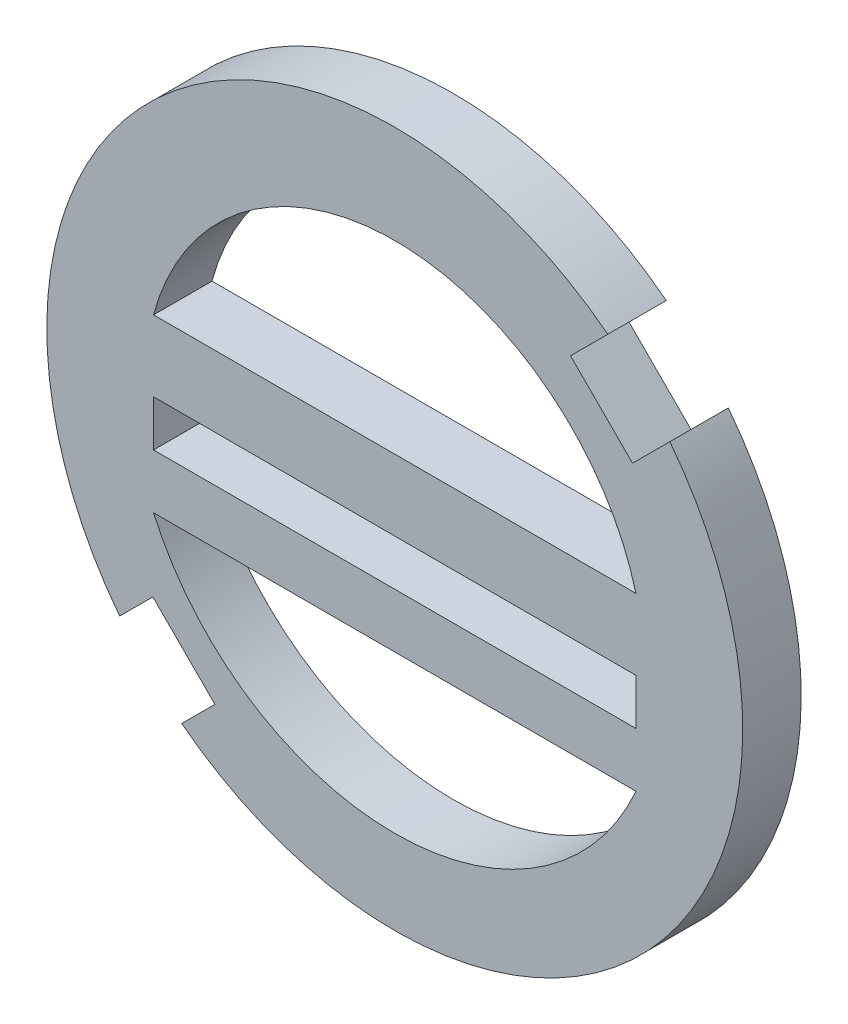
ISO-10303-21;
HEADER;
FILE_DESCRIPTION(('STEP AP214'),'2;1');
FILE_NAME('part.step','',(''),(''),'','','');
FILE_SCHEMA(('AUTOMOTIVE_DESIGN { 1 0 10303 214 1 1 1 1 }'));
ENDSEC;
DATA;
#1=APPLICATION_CONTEXT('core data for automotive mechanical design processes');
#2=APPLICATION_PROTOCOL_DEFINITION('international standard','automotive_design',2000,#1);
#3=PRODUCT_CONTEXT('',#1,'mechanical');
#4=PRODUCT('Part','Part','',(#3));
#5=PRODUCT_RELATED_PRODUCT_CATEGORY('part','',(#4));
#6=PRODUCT_DEFINITION_FORMATION('','',#4);
#7=PRODUCT_DEFINITION_CONTEXT('part definition',#1,'design');
#8=PRODUCT_DEFINITION('design','',#6,#7);
#9=PRODUCT_DEFINITION_SHAPE('','',#8);
#10=(LENGTH_UNIT() NAMED_UNIT(*) SI_UNIT(.MILLI.,.METRE.));
#11=(NAMED_UNIT(*) PLANE_ANGLE_UNIT() SI_UNIT($,.RADIAN.));
#12=(NAMED_UNIT(*) SI_UNIT($,.STERADIAN.) SOLID_ANGLE_UNIT());
#13=UNCERTAINTY_MEASURE_WITH_UNIT(LENGTH_MEASURE(1.E-05),#10,'distance_accuracy_value','');
#14=(GEOMETRIC_REPRESENTATION_CONTEXT(3) GLOBAL_UNCERTAINTY_ASSIGNED_CONTEXT((#13)) GLOBAL_UNIT_ASSIGNED_CONTEXT((#10,
#11,#12)) REPRESENTATION_CONTEXT('',''));
#15=CARTESIAN_POINT('',(0.,0.,0.));
#16=DIRECTION('',(0.,0.,1.));
#17=DIRECTION('',(1.,0.,0.));
#18=AXIS2_PLACEMENT_3D('',#15,#16,#17);
#19=CARTESIAN_POINT('',(0.,0.,12.7));
#20=DIRECTION('',(0.,0.,-1.));
#21=DIRECTION('',(-1.,0.,0.));
#22=AXIS2_PLACEMENT_3D('',#19,#20,#21);
#23=CYLINDRICAL_SURFACE('',#22,75.565);
#24=CARTESIAN_POINT('',(0.,0.,12.7));
#25=DIRECTION('',(0.,0.,1.));
#26=DIRECTION('',(1.,0.,0.));
#27=AXIS2_PLACEMENT_3D('',#24,#25,#26);
#28=CIRCLE('',#27,75.565);
#29=CARTESIAN_POINT('',(46.2711452661599,59.7415294477629,12.7));
#30=VERTEX_POINT('',#29);
#31=CARTESIAN_POINT('',(-59.7415294477625,-46.2711452661605,12.7));
#32=VERTEX_POINT('',#31);
#33=EDGE_CURVE('E266',#30,#32,#28,.T.);
#34=ORIENTED_EDGE('',*,*,#33,.F.);
#35=DIRECTION('',(0.,0.,-1.));
#36=VECTOR('',#35,1.);
#37=CARTESIAN_POINT('',(46.2711452661599,59.7415294477629,12.7));
#38=LINE('',#37,#36);
#39=CARTESIAN_POINT('',(46.2711452661599,59.7415294477629,0.));
#40=VERTEX_POINT('',#39);
#41=EDGE_CURVE('E11',#30,#40,#38,.T.);
#42=ORIENTED_EDGE('',*,*,#41,.T.);
#43=CARTESIAN_POINT('',(0.,0.,0.));
#44=DIRECTION('',(0.,0.,1.));
#45=DIRECTION('',(1.,0.,0.));
#46=AXIS2_PLACEMENT_3D('',#43,#44,#45);
#47=CIRCLE('',#46,75.565);
#48=CARTESIAN_POINT('',(-59.7415294477625,-46.2711452661605,0.));
#49=VERTEX_POINT('',#48);
#50=EDGE_CURVE('E170',#40,#49,#47,.T.);
#51=ORIENTED_EDGE('',*,*,#50,.T.);
#52=DIRECTION('',(0.,0.,-1.));
#53=VECTOR('',#52,1.);
#54=CARTESIAN_POINT('',(-59.7415294477625,-46.2711452661605,12.7));
#55=LINE('',#54,#53);
#56=EDGE_CURVE('E271',#49,#32,#55,.F.);
#57=ORIENTED_EDGE('',*,*,#56,.T.);
#58=EDGE_LOOP('',(#34,#42,#51,#57));
#59=FACE_BOUND('',#58,.T.);
#60=ADVANCED_FACE('F33',(#59),#23,.T.);
#61=CARTESIAN_POINT('',(0.,0.,12.7));
#62=DIRECTION('',(0.,0.,1.));
#63=DIRECTION('',(1.,0.,0.));
#64=AXIS2_PLACEMENT_3D('',#61,#62,#63);
#65=PLANE('',#64);
#66=DIRECTION('',(-0.707106781186545,-0.70710678118655,0.));
#67=VECTOR('',#66,1.);
#68=CARTESIAN_POINT('',(38.1660885145443,51.6364726961472,12.7));
#69=LINE('',#68,#67);
#70=CARTESIAN_POINT('',(38.1660885145443,51.6364726961472,12.7));
#71=VERTEX_POINT('',#70);
#72=EDGE_CURVE('E151',#30,#71,#69,.T.);
#73=ORIENTED_EDGE('',*,*,#72,.F.);
#74=ORIENTED_EDGE('',*,*,#33,.T.);
#75=DIRECTION('',(-0.707106781186527,-0.707106781186568,0.));
#76=VECTOR('',#75,1.);
#77=CARTESIAN_POINT('',(-61.5147544293228,-48.0443702477209,12.7));
#78=LINE('',#77,#76);
#79=CARTESIAN_POINT('',(-52.5344983082539,-39.0641141266515,12.7));
#80=VERTEX_POINT('',#79);
#81=EDGE_CURVE('E189',#80,#32,#78,.T.);
#82=ORIENTED_EDGE('',*,*,#81,.F.);
#83=DIRECTION('',(-0.70710678118655,0.707106781186545,0.));
#84=VECTOR('',#83,1.);
#85=CARTESIAN_POINT('',(-52.5344983082539,-39.0641141266515,12.7));
#86=LINE('',#85,#84);
#87=CARTESIAN_POINT('',(-39.0641141266503,-52.534498308255,12.7));
#88=VERTEX_POINT('',#87);
#89=EDGE_CURVE('E183',#88,#80,#86,.T.);
#90=ORIENTED_EDGE('',*,*,#89,.F.);
#91=DIRECTION('',(0.707106781186563,0.707106781186532,0.));
#92=VECTOR('',#91,1.);
#93=CARTESIAN_POINT('',(-39.0641141266503,-52.534498308255,12.7));
#94=LINE('',#93,#92);
#95=CARTESIAN_POINT('',(-46.2711452661591,-59.7415294477635,12.7));
#96=VERTEX_POINT('',#95);
#97=EDGE_CURVE('E191',#96,#88,#94,.T.);
#98=ORIENTED_EDGE('',*,*,#97,.F.);
#99=CARTESIAN_POINT('',(59.7415294477636,46.2711452661591,12.7));
#100=VERTEX_POINT('',#99);
#101=EDGE_CURVE('E263',#96,#100,#28,.T.);
#102=ORIENTED_EDGE('',*,*,#101,.T.);
#103=DIRECTION('',(0.707106781186546,0.707106781186549,0.));
#104=VECTOR('',#103,1.);
#105=CARTESIAN_POINT('',(60.6167288172172,47.1463446356127,12.7));
#106=LINE('',#105,#104);
#107=CARTESIAN_POINT('',(51.636472696148,38.1660885145435,12.7));
#108=VERTEX_POINT('',#107);
#109=EDGE_CURVE('E56',#108,#100,#106,.T.);
#110=ORIENTED_EDGE('',*,*,#109,.F.);
#111=DIRECTION('',(0.70710678118655,-0.707106781186545,0.));
#112=VECTOR('',#111,1.);
#113=CARTESIAN_POINT('',(51.636472696148,38.1660885145435,12.7));
#114=LINE('',#113,#112);
#115=EDGE_CURVE('E172',#71,#108,#114,.T.);
#116=ORIENTED_EDGE('',*,*,#115,.F.);
#117=EDGE_LOOP('',(#73,#74,#82,#90,#98,#102,#110,#116));
#118=FACE_BOUND('',#117,.T.);
#119=DIRECTION('',(1.,0.,0.));
#120=VECTOR('',#119,1.);
#121=CARTESIAN_POINT('',(-52.3875,-11.35,12.7));
#122=LINE('',#121,#120);
#123=CARTESIAN_POINT('',(-52.3875,-11.35,12.7));
#124=VERTEX_POINT('',#123);
#125=CARTESIAN_POINT('',(52.3875,-11.35,12.7));
#126=VERTEX_POINT('',#125);
#127=EDGE_CURVE('E234',#124,#126,#122,.T.);
#128=ORIENTED_EDGE('',*,*,#127,.F.);
#129=DIRECTION('',(0.,-1.,0.));
#130=VECTOR('',#129,1.);
#131=CARTESIAN_POINT('',(-52.3875,-1.34999999999999,12.7));
#132=LINE('',#131,#130);
#133=CARTESIAN_POINT('',(-52.3875,-1.34999999999999,12.7));
#134=VERTEX_POINT('',#133);
#135=EDGE_CURVE('E232',#134,#124,#132,.T.);
#136=ORIENTED_EDGE('',*,*,#135,.F.);
#137=DIRECTION('',(-1.,0.,0.));
#138=VECTOR('',#137,1.);
#139=CARTESIAN_POINT('',(-52.3875,-1.34999999999999,12.7));
#140=LINE('',#139,#138);
#141=CARTESIAN_POINT('',(52.3875,-1.35,12.7));
#142=VERTEX_POINT('',#141);
#143=EDGE_CURVE('E240',#142,#134,#140,.T.);
#144=ORIENTED_EDGE('',*,*,#143,.F.);
#145=DIRECTION('',(0.,1.,0.));
#146=VECTOR('',#145,1.);
#147=CARTESIAN_POINT('',(52.3875,-1.35,12.7));
#148=LINE('',#147,#146);
#149=EDGE_CURVE('E237',#126,#142,#148,.T.);
#150=ORIENTED_EDGE('',*,*,#149,.F.);
#151=EDGE_LOOP('',(#128,#136,#144,#150));
#152=FACE_BOUND('',#151,.T.);
#153=DIRECTION('',(1.,0.,0.));
#154=VECTOR('',#153,1.);
#155=CARTESIAN_POINT('',(-52.3875,14.055637655832,12.7));
#156=LINE('',#155,#154);
#157=CARTESIAN_POINT('',(-52.3875,14.055637655832,12.7));
#158=VERTEX_POINT('',#157);
#159=CARTESIAN_POINT('',(52.3875,14.055637655832,12.7));
#160=VERTEX_POINT('',#159);
#161=EDGE_CURVE('E218',#158,#160,#156,.T.);
#162=ORIENTED_EDGE('',*,*,#161,.F.);
#163=CARTESIAN_POINT('',(0.,0.,12.7));
#164=DIRECTION('',(0.,0.,1.));
#165=DIRECTION('',(-1.,0.,0.));
#166=AXIS2_PLACEMENT_3D('',#163,#164,#165);
#167=CIRCLE('',#166,54.2403088686084);
#168=EDGE_CURVE('E215',#160,#158,#167,.T.);
#169=ORIENTED_EDGE('',*,*,#168,.F.);
#170=EDGE_LOOP('',(#162,#169));
#171=FACE_BOUND('',#170,.T.);
#172=DIRECTION('',(-1.,0.,0.));
#173=VECTOR('',#172,1.);
#174=CARTESIAN_POINT('',(-52.3875,-23.1544562349696,12.7));
#175=LINE('',#174,#173);
#176=CARTESIAN_POINT('',(52.3875,-23.1544562349696,12.7));
#177=VERTEX_POINT('',#176);
#178=CARTESIAN_POINT('',(-52.3875,-23.1544562349696,12.7));
#179=VERTEX_POINT('',#178);
#180=EDGE_CURVE('E201',#177,#179,#175,.T.);
#181=ORIENTED_EDGE('',*,*,#180,.F.);
#182=CARTESIAN_POINT('',(0.,0.,12.7));
#183=DIRECTION('',(0.,0.,1.));
#184=DIRECTION('',(1.,0.,0.));
#185=AXIS2_PLACEMENT_3D('',#182,#183,#184);
#186=CIRCLE('',#185,57.2763389174546);
#187=EDGE_CURVE('E198',#179,#177,#186,.T.);
#188=ORIENTED_EDGE('',*,*,#187,.F.);
#189=EDGE_LOOP('',(#181,#188));
#190=FACE_BOUND('',#189,.T.);
#191=ADVANCED_FACE('F278',(#118,#152,#171,#190),#65,.T.);
#192=CARTESIAN_POINT('',(0.,0.,0.));
#193=DIRECTION('',(0.,0.,1.));
#194=DIRECTION('',(1.,0.,0.));
#195=AXIS2_PLACEMENT_3D('',#192,#193,#194);
#196=PLANE('',#195);
#197=ORIENTED_EDGE('',*,*,#50,.F.);
#198=DIRECTION('',(-0.707106781186545,-0.70710678118655,0.));
#199=VECTOR('',#198,1.);
#200=CARTESIAN_POINT('',(38.1660885145443,51.6364726961472,0.));
#201=LINE('',#200,#199);
#202=CARTESIAN_POINT('',(38.1660885145443,51.6364726961472,0.));
#203=VERTEX_POINT('',#202);
#204=EDGE_CURVE('E149',#40,#203,#201,.T.);
#205=ORIENTED_EDGE('',*,*,#204,.T.);
#206=DIRECTION('',(0.70710678118655,-0.707106781186545,0.));
#207=VECTOR('',#206,1.);
#208=CARTESIAN_POINT('',(51.636472696148,38.1660885145435,0.));
#209=LINE('',#208,#207);
#210=CARTESIAN_POINT('',(51.636472696148,38.1660885145435,0.));
#211=VERTEX_POINT('',#210);
#212=EDGE_CURVE('E159',#203,#211,#209,.T.);
#213=ORIENTED_EDGE('',*,*,#212,.T.);
#214=DIRECTION('',(0.707106781186546,0.707106781186549,0.));
#215=VECTOR('',#214,1.);
#216=CARTESIAN_POINT('',(60.6167288172172,47.1463446356127,0.));
#217=LINE('',#216,#215);
#218=CARTESIAN_POINT('',(59.7415294477636,46.2711452661591,0.));
#219=VERTEX_POINT('',#218);
#220=EDGE_CURVE('E156',#211,#219,#217,.T.);
#221=ORIENTED_EDGE('',*,*,#220,.T.);
#222=CARTESIAN_POINT('',(-46.2711452661591,-59.7415294477635,0.));
#223=VERTEX_POINT('',#222);
#224=EDGE_CURVE('E262',#223,#219,#47,.T.);
#225=ORIENTED_EDGE('',*,*,#224,.F.);
#226=DIRECTION('',(0.707106781186563,0.707106781186532,0.));
#227=VECTOR('',#226,1.);
#228=CARTESIAN_POINT('',(-39.0641141266503,-52.534498308255,0.));
#229=LINE('',#228,#227);
#230=CARTESIAN_POINT('',(-39.0641141266503,-52.534498308255,0.));
#231=VERTEX_POINT('',#230);
#232=EDGE_CURVE('E48',#223,#231,#229,.T.);
#233=ORIENTED_EDGE('',*,*,#232,.T.);
#234=DIRECTION('',(-0.70710678118655,0.707106781186545,0.));
#235=VECTOR('',#234,1.);
#236=CARTESIAN_POINT('',(-52.5344983082539,-39.0641141266515,0.));
#237=LINE('',#236,#235);
#238=CARTESIAN_POINT('',(-52.5344983082539,-39.0641141266515,0.));
#239=VERTEX_POINT('',#238);
#240=EDGE_CURVE('E185',#231,#239,#237,.T.);
#241=ORIENTED_EDGE('',*,*,#240,.T.);
#242=DIRECTION('',(-0.707106781186527,-0.707106781186568,0.));
#243=VECTOR('',#242,1.);
#244=CARTESIAN_POINT('',(-61.5147544293228,-48.0443702477209,0.));
#245=LINE('',#244,#243);
#246=EDGE_CURVE('E181',#239,#49,#245,.T.);
#247=ORIENTED_EDGE('',*,*,#246,.T.);
#248=EDGE_LOOP('',(#197,#205,#213,#221,#225,#233,#241,#247));
#249=FACE_BOUND('',#248,.T.);
#250=CARTESIAN_POINT('',(0.,0.,0.));
#251=DIRECTION('',(0.,0.,1.));
#252=DIRECTION('',(-1.,0.,0.));
#253=AXIS2_PLACEMENT_3D('',#250,#251,#252);
#254=CIRCLE('',#253,54.2403088686084);
#255=CARTESIAN_POINT('',(52.3875,14.055637655832,0.));
#256=VERTEX_POINT('',#255);
#257=CARTESIAN_POINT('',(-52.3875,14.055637655832,0.));
#258=VERTEX_POINT('',#257);
#259=EDGE_CURVE('E214',#256,#258,#254,.T.);
#260=ORIENTED_EDGE('',*,*,#259,.T.);
#261=DIRECTION('',(1.,0.,0.));
#262=VECTOR('',#261,1.);
#263=CARTESIAN_POINT('',(-52.3875,14.055637655832,0.));
#264=LINE('',#263,#262);
#265=EDGE_CURVE('E219',#258,#256,#264,.T.);
#266=ORIENTED_EDGE('',*,*,#265,.T.);
#267=EDGE_LOOP('',(#260,#266));
#268=FACE_BOUND('',#267,.T.);
#269=DIRECTION('',(0.,-1.,0.));
#270=VECTOR('',#269,1.);
#271=CARTESIAN_POINT('',(-52.3875,-1.34999999999999,0.));
#272=LINE('',#271,#270);
#273=CARTESIAN_POINT('',(-52.3875,-1.34999999999999,0.));
#274=VERTEX_POINT('',#273);
#275=CARTESIAN_POINT('',(-52.3875,-11.35,0.));
#276=VERTEX_POINT('',#275);
#277=EDGE_CURVE('E231',#274,#276,#272,.T.);
#278=ORIENTED_EDGE('',*,*,#277,.T.);
#279=DIRECTION('',(1.,0.,0.));
#280=VECTOR('',#279,1.);
#281=CARTESIAN_POINT('',(-52.3875,-11.35,0.));
#282=LINE('',#281,#280);
#283=CARTESIAN_POINT('',(52.3875,-11.35,0.));
#284=VERTEX_POINT('',#283);
#285=EDGE_CURVE('E245',#276,#284,#282,.T.);
#286=ORIENTED_EDGE('',*,*,#285,.T.);
#287=DIRECTION('',(0.,1.,0.));
#288=VECTOR('',#287,1.);
#289=CARTESIAN_POINT('',(52.3875,-1.35,0.));
#290=LINE('',#289,#288);
#291=CARTESIAN_POINT('',(52.3875,-1.35,0.));
#292=VERTEX_POINT('',#291);
#293=EDGE_CURVE('E248',#284,#292,#290,.T.);
#294=ORIENTED_EDGE('',*,*,#293,.T.);
#295=DIRECTION('',(-1.,0.,0.));
#296=VECTOR('',#295,1.);
#297=CARTESIAN_POINT('',(-52.3875,-1.34999999999999,0.));
#298=LINE('',#297,#296);
#299=EDGE_CURVE('E235',#292,#274,#298,.T.);
#300=ORIENTED_EDGE('',*,*,#299,.T.);
#301=EDGE_LOOP('',(#278,#286,#294,#300));
#302=FACE_BOUND('',#301,.T.);
#303=CARTESIAN_POINT('',(0.,0.,0.));
#304=DIRECTION('',(0.,0.,1.));
#305=DIRECTION('',(1.,0.,0.));
#306=AXIS2_PLACEMENT_3D('',#303,#304,#305);
#307=CIRCLE('',#306,57.2763389174546);
#308=CARTESIAN_POINT('',(-52.3875,-23.1544562349696,0.));
#309=VERTEX_POINT('',#308);
#310=CARTESIAN_POINT('',(52.3875,-23.1544562349696,0.));
#311=VERTEX_POINT('',#310);
#312=EDGE_CURVE('E179',#309,#311,#307,.T.);
#313=ORIENTED_EDGE('',*,*,#312,.T.);
#314=DIRECTION('',(-1.,0.,0.));
#315=VECTOR('',#314,1.);
#316=CARTESIAN_POINT('',(-52.3875,-23.1544562349696,0.));
#317=LINE('',#316,#315);
#318=EDGE_CURVE('E202',#311,#309,#317,.T.);
#319=ORIENTED_EDGE('',*,*,#318,.T.);
#320=EDGE_LOOP('',(#313,#319));
#321=FACE_BOUND('',#320,.T.);
#322=ADVANCED_FACE('F166',(#249,#268,#302,#321),#196,.F.);
#323=ORIENTED_EDGE('',*,*,#224,.T.);
#324=DIRECTION('',(0.,0.,-1.));
#325=VECTOR('',#324,1.);
#326=CARTESIAN_POINT('',(59.7415294477636,46.2711452661591,12.7));
#327=LINE('',#326,#325);
#328=EDGE_CURVE('E41',#219,#100,#327,.F.);
#329=ORIENTED_EDGE('',*,*,#328,.T.);
#330=ORIENTED_EDGE('',*,*,#101,.F.);
#331=DIRECTION('',(0.,0.,-1.));
#332=VECTOR('',#331,1.);
#333=CARTESIAN_POINT('',(-46.2711452661591,-59.7415294477635,12.7));
#334=LINE('',#333,#332);
#335=EDGE_CURVE('E269',#96,#223,#334,.T.);
#336=ORIENTED_EDGE('',*,*,#335,.T.);
#337=EDGE_LOOP('',(#323,#329,#330,#336));
#338=FACE_BOUND('',#337,.T.);
#339=ADVANCED_FACE('F35',(#338),#23,.T.);
#340=CARTESIAN_POINT('',(-52.3875,-1.34999999999999,12.7));
#341=DIRECTION('',(1.,0.,0.));
#342=DIRECTION('',(0.,0.,-1.));
#343=AXIS2_PLACEMENT_3D('',#340,#341,#342);
#344=PLANE('',#343);
#345=ORIENTED_EDGE('',*,*,#277,.F.);
#346=DIRECTION('',(0.,0.,-1.));
#347=VECTOR('',#346,1.);
#348=CARTESIAN_POINT('',(-52.3875,-1.34999999999999,12.7));
#349=LINE('',#348,#347);
#350=EDGE_CURVE('E242',#134,#274,#349,.T.);
#351=ORIENTED_EDGE('',*,*,#350,.F.);
#352=ORIENTED_EDGE('',*,*,#135,.T.);
#353=DIRECTION('',(0.,0.,-1.));
#354=VECTOR('',#353,1.);
#355=CARTESIAN_POINT('',(-52.3875,-11.35,12.7));
#356=LINE('',#355,#354);
#357=EDGE_CURVE('E259',#124,#276,#356,.T.);
#358=ORIENTED_EDGE('',*,*,#357,.T.);
#359=EDGE_LOOP('',(#345,#351,#352,#358));
#360=FACE_BOUND('',#359,.T.);
#361=ADVANCED_FACE('F310',(#360),#344,.T.);
#362=CARTESIAN_POINT('',(-52.3875,-11.35,12.7));
#363=DIRECTION('',(0.,1.,0.));
#364=DIRECTION('',(-1.,0.,0.));
#365=AXIS2_PLACEMENT_3D('',#362,#363,#364);
#366=PLANE('',#365);
#367=ORIENTED_EDGE('',*,*,#285,.F.);
#368=ORIENTED_EDGE('',*,*,#357,.F.);
#369=ORIENTED_EDGE('',*,*,#127,.T.);
#370=DIRECTION('',(0.,0.,-1.));
#371=VECTOR('',#370,1.);
#372=CARTESIAN_POINT('',(52.3875,-11.35,12.7));
#373=LINE('',#372,#371);
#374=EDGE_CURVE('E257',#126,#284,#373,.T.);
#375=ORIENTED_EDGE('',*,*,#374,.T.);
#376=EDGE_LOOP('',(#367,#368,#369,#375));
#377=FACE_BOUND('',#376,.T.);
#378=ADVANCED_FACE('F315',(#377),#366,.T.);
#379=CARTESIAN_POINT('',(52.3875,-1.35,12.7));
#380=DIRECTION('',(-1.,0.,0.));
#381=DIRECTION('',(0.,0.,1.));
#382=AXIS2_PLACEMENT_3D('',#379,#380,#381);
#383=PLANE('',#382);
#384=ORIENTED_EDGE('',*,*,#293,.F.);
#385=ORIENTED_EDGE('',*,*,#374,.F.);
#386=ORIENTED_EDGE('',*,*,#149,.T.);
#387=DIRECTION('',(0.,0.,-1.));
#388=VECTOR('',#387,1.);
#389=CARTESIAN_POINT('',(52.3875,-1.35,12.7));
#390=LINE('',#389,#388);
#391=EDGE_CURVE('E255',#142,#292,#390,.T.);
#392=ORIENTED_EDGE('',*,*,#391,.T.);
#393=EDGE_LOOP('',(#384,#385,#386,#392));
#394=FACE_BOUND('',#393,.T.);
#395=ADVANCED_FACE('F323',(#394),#383,.T.);
#396=CARTESIAN_POINT('',(-52.3875,-1.34999999999999,12.7));
#397=DIRECTION('',(0.,-1.,0.));
#398=DIRECTION('',(1.,0.,0.));
#399=AXIS2_PLACEMENT_3D('',#396,#397,#398);
#400=PLANE('',#399);
#401=ORIENTED_EDGE('',*,*,#299,.F.);
#402=ORIENTED_EDGE('',*,*,#391,.F.);
#403=ORIENTED_EDGE('',*,*,#143,.T.);
#404=ORIENTED_EDGE('',*,*,#350,.T.);
#405=EDGE_LOOP('',(#401,#402,#403,#404));
#406=FACE_BOUND('',#405,.T.);
#407=ADVANCED_FACE('F327',(#406),#400,.T.);
#408=CARTESIAN_POINT('',(0.,0.,12.7));
#409=DIRECTION('',(0.,0.,-1.));
#410=DIRECTION('',(-1.,0.,0.));
#411=AXIS2_PLACEMENT_3D('',#408,#409,#410);
#412=CYLINDRICAL_SURFACE('',#411,54.2403088686084);
#413=ORIENTED_EDGE('',*,*,#259,.F.);
#414=DIRECTION('',(0.,0.,-1.));
#415=VECTOR('',#414,1.);
#416=CARTESIAN_POINT('',(52.3875,14.055637655832,12.7));
#417=LINE('',#416,#415);
#418=EDGE_CURVE('E221',#160,#256,#417,.T.);
#419=ORIENTED_EDGE('',*,*,#418,.F.);
#420=ORIENTED_EDGE('',*,*,#168,.T.);
#421=DIRECTION('',(0.,0.,-1.));
#422=VECTOR('',#421,1.);
#423=CARTESIAN_POINT('',(-52.3875,14.055637655832,12.7));
#424=LINE('',#423,#422);
#425=EDGE_CURVE('E228',#158,#258,#424,.T.);
#426=ORIENTED_EDGE('',*,*,#425,.T.);
#427=EDGE_LOOP('',(#413,#419,#420,#426));
#428=FACE_BOUND('',#427,.T.);
#429=ADVANCED_FACE('F331',(#428),#412,.F.);
#430=CARTESIAN_POINT('',(-52.3875,14.055637655832,12.7));
#431=DIRECTION('',(0.,1.,0.));
#432=DIRECTION('',(0.,0.,1.));
#433=AXIS2_PLACEMENT_3D('',#430,#431,#432);
#434=PLANE('',#433);
#435=ORIENTED_EDGE('',*,*,#265,.F.);
#436=ORIENTED_EDGE('',*,*,#425,.F.);
#437=ORIENTED_EDGE('',*,*,#161,.T.);
#438=ORIENTED_EDGE('',*,*,#418,.T.);
#439=EDGE_LOOP('',(#435,#436,#437,#438));
#440=FACE_BOUND('',#439,.T.);
#441=ADVANCED_FACE('F335',(#440),#434,.T.);
#442=CARTESIAN_POINT('',(0.,0.,12.7));
#443=DIRECTION('',(0.,0.,-1.));
#444=DIRECTION('',(-1.,0.,0.));
#445=AXIS2_PLACEMENT_3D('',#442,#443,#444);
#446=CYLINDRICAL_SURFACE('',#445,57.2763389174546);
#447=ORIENTED_EDGE('',*,*,#312,.F.);
#448=DIRECTION('',(0.,0.,-1.));
#449=VECTOR('',#448,1.);
#450=CARTESIAN_POINT('',(-52.3875,-23.1544562349696,12.7));
#451=LINE('',#450,#449);
#452=EDGE_CURVE('E204',#179,#309,#451,.T.);
#453=ORIENTED_EDGE('',*,*,#452,.F.);
#454=ORIENTED_EDGE('',*,*,#187,.T.);
#455=DIRECTION('',(0.,0.,-1.));
#456=VECTOR('',#455,1.);
#457=CARTESIAN_POINT('',(52.3875,-23.1544562349696,12.7));
#458=LINE('',#457,#456);
#459=EDGE_CURVE('E211',#177,#311,#458,.T.);
#460=ORIENTED_EDGE('',*,*,#459,.T.);
#461=EDGE_LOOP('',(#447,#453,#454,#460));
#462=FACE_BOUND('',#461,.T.);
#463=ADVANCED_FACE('F301',(#462),#446,.F.);
#464=CARTESIAN_POINT('',(-52.3875,-23.1544562349696,12.7));
#465=DIRECTION('',(0.,-1.,0.));
#466=DIRECTION('',(0.,0.,-1.));
#467=AXIS2_PLACEMENT_3D('',#464,#465,#466);
#468=PLANE('',#467);
#469=ORIENTED_EDGE('',*,*,#318,.F.);
#470=ORIENTED_EDGE('',*,*,#459,.F.);
#471=ORIENTED_EDGE('',*,*,#180,.T.);
#472=ORIENTED_EDGE('',*,*,#452,.T.);
#473=EDGE_LOOP('',(#469,#470,#471,#472));
#474=FACE_BOUND('',#473,.T.);
#475=ADVANCED_FACE('F294',(#474),#468,.T.);
#476=CARTESIAN_POINT('',(-61.5147544293228,-48.0443702477209,0.));
#477=DIRECTION('',(-0.707106781186568,0.707106781186527,0.));
#478=DIRECTION('',(-0.707106781186527,-0.707106781186568,0.));
#479=AXIS2_PLACEMENT_3D('',#476,#477,#478);
#480=PLANE('',#479);
#481=ORIENTED_EDGE('',*,*,#246,.F.);
#482=DIRECTION('',(0.,0.,1.));
#483=VECTOR('',#482,1.);
#484=CARTESIAN_POINT('',(-52.5344983082539,-39.0641141266515,0.));
#485=LINE('',#484,#483);
#486=EDGE_CURVE('E177',#239,#80,#485,.T.);
#487=ORIENTED_EDGE('',*,*,#486,.T.);
#488=ORIENTED_EDGE('',*,*,#81,.T.);
#489=ORIENTED_EDGE('',*,*,#56,.F.);
#490=EDGE_LOOP('',(#481,#487,#488,#489));
#491=FACE_BOUND('',#490,.T.);
#492=ADVANCED_FACE('F292',(#491),#480,.F.);
#493=CARTESIAN_POINT('',(-39.0641141266503,-52.534498308255,0.));
#494=DIRECTION('',(0.707106781186532,-0.707106781186563,0.));
#495=DIRECTION('',(0.707106781186563,0.707106781186532,0.));
#496=AXIS2_PLACEMENT_3D('',#493,#494,#495);
#497=PLANE('',#496);
#498=ORIENTED_EDGE('',*,*,#97,.T.);
#499=DIRECTION('',(0.,0.,1.));
#500=VECTOR('',#499,1.);
#501=CARTESIAN_POINT('',(-39.0641141266503,-52.534498308255,0.));
#502=LINE('',#501,#500);
#503=EDGE_CURVE('E188',#231,#88,#502,.T.);
#504=ORIENTED_EDGE('',*,*,#503,.F.);
#505=ORIENTED_EDGE('',*,*,#232,.F.);
#506=ORIENTED_EDGE('',*,*,#335,.F.);
#507=EDGE_LOOP('',(#498,#504,#505,#506));
#508=FACE_BOUND('',#507,.T.);
#509=ADVANCED_FACE('F282',(#508),#497,.F.);
#510=CARTESIAN_POINT('',(-52.5344983082539,-39.0641141266515,0.));
#511=DIRECTION('',(0.707106781186545,0.70710678118655,0.));
#512=DIRECTION('',(-0.70710678118655,0.707106781186545,0.));
#513=AXIS2_PLACEMENT_3D('',#510,#511,#512);
#514=PLANE('',#513);
#515=ORIENTED_EDGE('',*,*,#89,.T.);
#516=ORIENTED_EDGE('',*,*,#486,.F.);
#517=ORIENTED_EDGE('',*,*,#240,.F.);
#518=ORIENTED_EDGE('',*,*,#503,.T.);
#519=EDGE_LOOP('',(#515,#516,#517,#518));
#520=FACE_BOUND('',#519,.T.);
#521=ADVANCED_FACE('F285',(#520),#514,.F.);
#522=CARTESIAN_POINT('',(38.1660885145443,51.6364726961472,0.));
#523=DIRECTION('',(-0.70710678118655,0.707106781186545,0.));
#524=DIRECTION('',(-0.707106781186545,-0.70710678118655,0.));
#525=AXIS2_PLACEMENT_3D('',#522,#523,#524);
#526=PLANE('',#525);
#527=ORIENTED_EDGE('',*,*,#72,.T.);
#528=DIRECTION('',(0.,0.,1.));
#529=VECTOR('',#528,1.);
#530=CARTESIAN_POINT('',(38.1660885145443,51.6364726961472,0.));
#531=LINE('',#530,#529);
#532=EDGE_CURVE('E145',#203,#71,#531,.T.);
#533=ORIENTED_EDGE('',*,*,#532,.F.);
#534=ORIENTED_EDGE('',*,*,#204,.F.);
#535=ORIENTED_EDGE('',*,*,#41,.F.);
#536=EDGE_LOOP('',(#527,#533,#534,#535));
#537=FACE_BOUND('',#536,.T.);
#538=ADVANCED_FACE('F147',(#537),#526,.F.);
#539=CARTESIAN_POINT('',(60.6167288172172,47.1463446356127,0.));
#540=DIRECTION('',(0.707106781186549,-0.707106781186545,0.));
#541=DIRECTION('',(0.707106781186546,0.70710678118655,0.));
#542=AXIS2_PLACEMENT_3D('',#539,#540,#541);
#543=PLANE('',#542);
#544=ORIENTED_EDGE('',*,*,#220,.F.);
#545=DIRECTION('',(0.,0.,1.));
#546=VECTOR('',#545,1.);
#547=CARTESIAN_POINT('',(51.636472696148,38.1660885145435,0.));
#548=LINE('',#547,#546);
#549=EDGE_CURVE('E155',#211,#108,#548,.T.);
#550=ORIENTED_EDGE('',*,*,#549,.T.);
#551=ORIENTED_EDGE('',*,*,#109,.T.);
#552=ORIENTED_EDGE('',*,*,#328,.F.);
#553=EDGE_LOOP('',(#544,#550,#551,#552));
#554=FACE_BOUND('',#553,.T.);
#555=ADVANCED_FACE('F287',(#554),#543,.F.);
#556=CARTESIAN_POINT('',(51.636472696148,38.1660885145435,0.));
#557=DIRECTION('',(-0.707106781186545,-0.70710678118655,0.));
#558=DIRECTION('',(0.70710678118655,-0.707106781186545,0.));
#559=AXIS2_PLACEMENT_3D('',#556,#557,#558);
#560=PLANE('',#559);
#561=ORIENTED_EDGE('',*,*,#115,.T.);
#562=ORIENTED_EDGE('',*,*,#549,.F.);
#563=ORIENTED_EDGE('',*,*,#212,.F.);
#564=ORIENTED_EDGE('',*,*,#532,.T.);
#565=EDGE_LOOP('',(#561,#562,#563,#564));
#566=FACE_BOUND('',#565,.T.);
#567=ADVANCED_FACE('F160',(#566),#560,.F.);
#568=CLOSED_SHELL('',(#60,#191,#322,#339,#361,#378,#395,#407,#429,#441,#463,#475,#492,#509,#521,
#538,#555,#567));
#569=MANIFOLD_SOLID_BREP('B2',#568);
#570=ADVANCED_BREP_SHAPE_REPRESENTATION('',(#18,#569),#14);
#571=SHAPE_DEFINITION_REPRESENTATION(#9,#570);
ENDSEC;
END-ISO-10303-21;
